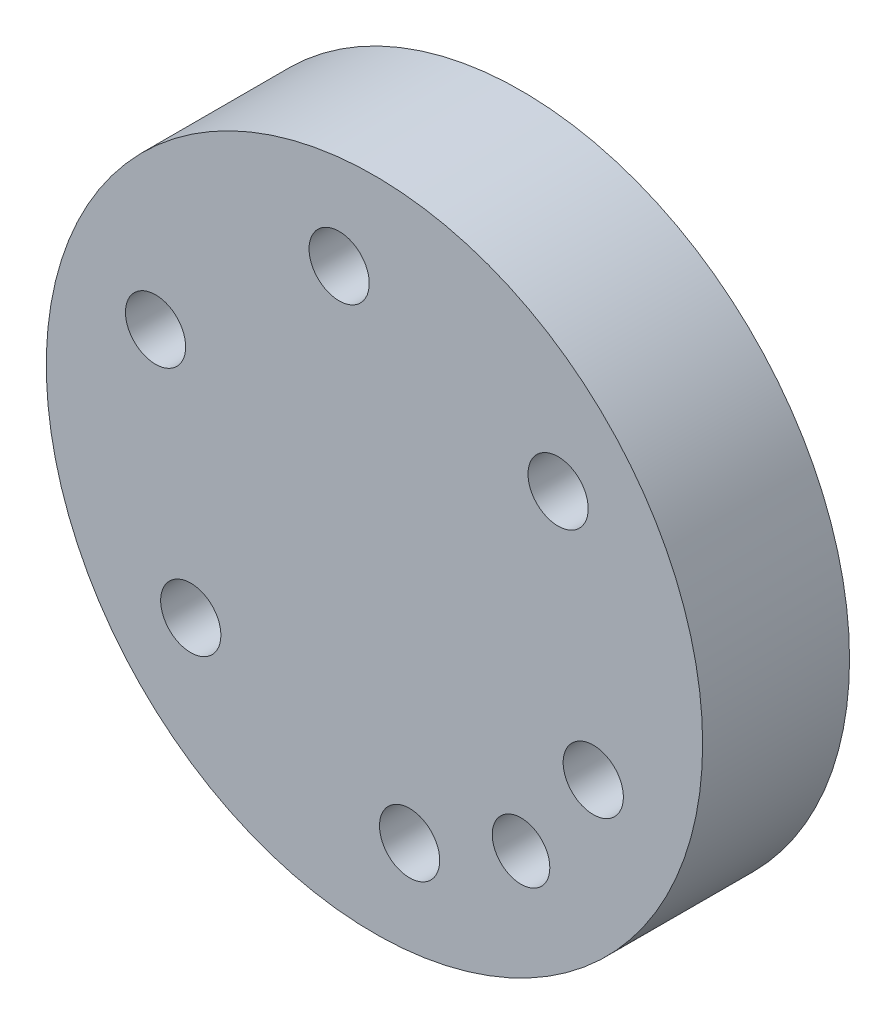
ISO-10303-21;
HEADER;
FILE_DESCRIPTION(('STEP AP214'),'2;1');
FILE_NAME('part.step','',(''),(''),'','','');
FILE_SCHEMA(('AUTOMOTIVE_DESIGN { 1 0 10303 214 1 1 1 1 }'));
ENDSEC;
DATA;
#1=APPLICATION_CONTEXT('core data for automotive mechanical design processes');
#2=APPLICATION_PROTOCOL_DEFINITION('international standard','automotive_design',2000,#1);
#3=PRODUCT_CONTEXT('',#1,'mechanical');
#4=PRODUCT('Part','Part','',(#3));
#5=PRODUCT_RELATED_PRODUCT_CATEGORY('part','',(#4));
#6=PRODUCT_DEFINITION_FORMATION('','',#4);
#7=PRODUCT_DEFINITION_CONTEXT('part definition',#1,'design');
#8=PRODUCT_DEFINITION('design','',#6,#7);
#9=PRODUCT_DEFINITION_SHAPE('','',#8);
#10=(LENGTH_UNIT() NAMED_UNIT(*) SI_UNIT(.MILLI.,.METRE.));
#11=(NAMED_UNIT(*) PLANE_ANGLE_UNIT() SI_UNIT($,.RADIAN.));
#12=(NAMED_UNIT(*) SI_UNIT($,.STERADIAN.) SOLID_ANGLE_UNIT());
#13=UNCERTAINTY_MEASURE_WITH_UNIT(LENGTH_MEASURE(1.E-05),#10,'distance_accuracy_value','');
#14=(GEOMETRIC_REPRESENTATION_CONTEXT(3) GLOBAL_UNCERTAINTY_ASSIGNED_CONTEXT((#13)) GLOBAL_UNIT_ASSIGNED_CONTEXT((#10,
#11,#12)) REPRESENTATION_CONTEXT('',''));
#15=CARTESIAN_POINT('',(0.,0.,0.));
#16=DIRECTION('',(0.,0.,1.));
#17=DIRECTION('',(1.,0.,0.));
#18=AXIS2_PLACEMENT_3D('',#15,#16,#17);
#19=CARTESIAN_POINT('',(22.3808308558776,278.150413141266,-291.081485964987));
#20=DIRECTION('',(0.,0.,1.));
#21=DIRECTION('',(1.,0.,0.));
#22=AXIS2_PLACEMENT_3D('',#19,#20,#21);
#23=CYLINDRICAL_SURFACE('',#22,88.7);
#24=CARTESIAN_POINT('',(22.3808308558776,278.150413141266,-24.7));
#25=DIRECTION('',(0.,0.,1.));
#26=DIRECTION('',(0.,-1.,0.));
#27=AXIS2_PLACEMENT_3D('',#24,#25,#26);
#28=CIRCLE('',#27,88.7);
#29=CARTESIAN_POINT('',(22.3808308558776,189.450413141266,-24.7));
#30=VERTEX_POINT('',#29);
#31=EDGE_CURVE('E65',#30,#30,#28,.F.);
#32=ORIENTED_EDGE('',*,*,#31,.F.);
#33=EDGE_LOOP('',(#32));
#34=FACE_BOUND('',#33,.T.);
#35=CARTESIAN_POINT('',(22.3808308558776,278.150413141266,15.));
#36=DIRECTION('',(0.,0.,1.));
#37=DIRECTION('',(1.,0.,0.));
#38=AXIS2_PLACEMENT_3D('',#35,#36,#37);
#39=CIRCLE('',#38,88.7);
#40=CARTESIAN_POINT('',(111.080830855878,278.150413141266,15.));
#41=VERTEX_POINT('',#40);
#42=EDGE_CURVE('E69',#41,#41,#39,.T.);
#43=ORIENTED_EDGE('',*,*,#42,.F.);
#44=EDGE_LOOP('',(#43));
#45=FACE_BOUND('',#44,.T.);
#46=ADVANCED_FACE('F39',(#34,#45),#23,.T.);
#47=CARTESIAN_POINT('',(22.3808308558776,278.150413141266,-291.081485964987));
#48=DIRECTION('',(0.,0.,1.));
#49=DIRECTION('',(1.,0.,0.));
#50=AXIS2_PLACEMENT_3D('',#47,#48,#49);
#51=CYLINDRICAL_SURFACE('',#50,76.4000000000001);
#52=CARTESIAN_POINT('',(22.3808308558776,278.150413141266,-15.9141467497714));
#53=DIRECTION('',(0.,0.,1.));
#54=DIRECTION('',(1.,0.,0.));
#55=AXIS2_PLACEMENT_3D('',#52,#53,#54);
#56=CIRCLE('',#55,76.4000000000001);
#57=CARTESIAN_POINT('',(98.7808308558778,278.150413141266,-15.9141467497714));
#58=VERTEX_POINT('',#57);
#59=EDGE_CURVE('E54',#58,#58,#56,.F.);
#60=ORIENTED_EDGE('',*,*,#59,.T.);
#61=EDGE_LOOP('',(#60));
#62=FACE_BOUND('',#61,.T.);
#63=CARTESIAN_POINT('',(22.3808308558776,278.150413141266,0.));
#64=DIRECTION('',(0.,0.,1.));
#65=DIRECTION('',(1.,0.,0.));
#66=AXIS2_PLACEMENT_3D('',#63,#64,#65);
#67=CIRCLE('',#66,76.4000000000001);
#68=CARTESIAN_POINT('',(98.7808308558778,278.150413141266,0.));
#69=VERTEX_POINT('',#68);
#70=EDGE_CURVE('E66',#69,#69,#67,.T.);
#71=ORIENTED_EDGE('',*,*,#70,.T.);
#72=EDGE_LOOP('',(#71));
#73=FACE_BOUND('',#72,.T.);
#74=ADVANCED_FACE('F135',(#62,#73),#51,.F.);
#75=CARTESIAN_POINT('',(22.3808308558776,278.150413141266,-24.7));
#76=DIRECTION('',(0.,0.,1.));
#77=DIRECTION('',(0.972273860255017,-0.233845121105419,0.));
#78=AXIS2_PLACEMENT_3D('',#75,#76,#77);
#79=PLANE('',#78);
#80=CARTESIAN_POINT('',(22.3808308558776,278.150413141266,-24.7));
#81=DIRECTION('',(0.,0.,1.));
#82=DIRECTION('',(0.,-1.,0.));
#83=AXIS2_PLACEMENT_3D('',#80,#81,#82);
#84=CIRCLE('',#83,82.0696949688358);
#85=CARTESIAN_POINT('',(22.3808308558776,196.08071817243,-24.7));
#86=VERTEX_POINT('',#85);
#87=EDGE_CURVE('E46',#86,#86,#84,.T.);
#88=ORIENTED_EDGE('',*,*,#87,.T.);
#89=EDGE_LOOP('',(#88));
#90=FACE_BOUND('',#89,.T.);
#91=ORIENTED_EDGE('',*,*,#31,.T.);
#92=EDGE_LOOP('',(#91));
#93=FACE_BOUND('',#92,.T.);
#94=ADVANCED_FACE('F130',(#90,#93),#79,.F.);
#95=CARTESIAN_POINT('',(22.3808308558776,278.150413141266,0.));
#96=DIRECTION('',(0.,0.,1.));
#97=DIRECTION('',(1.,0.,0.));
#98=AXIS2_PLACEMENT_3D('',#95,#96,#97);
#99=PLANE('',#98);
#100=CARTESIAN_POINT('',(61.9964694726047,228.53305193742,0.));
#101=DIRECTION('',(0.,0.,1.));
#102=DIRECTION('',(1.,0.,0.));
#103=AXIS2_PLACEMENT_3D('',#100,#101,#102);
#104=CIRCLE('',#103,9.77968966364631);
#105=CARTESIAN_POINT('',(71.776159136251,228.53305193742,0.));
#106=VERTEX_POINT('',#105);
#107=EDGE_CURVE('E62',#106,#106,#104,.T.);
#108=ORIENTED_EDGE('',*,*,#107,.T.);
#109=EDGE_LOOP('',(#108));
#110=FACE_BOUND('',#109,.T.);
#111=CARTESIAN_POINT('',(81.5193470873584,254.971228105767,0.));
#112=DIRECTION('',(0.,0.,1.));
#113=DIRECTION('',(1.,0.,0.));
#114=AXIS2_PLACEMENT_3D('',#111,#112,#113);
#115=CIRCLE('',#114,8.13749999999999);
#116=CARTESIAN_POINT('',(89.6568470873584,254.971228105767,0.));
#117=VERTEX_POINT('',#116);
#118=EDGE_CURVE('E105',#117,#117,#115,.T.);
#119=ORIENTED_EDGE('',*,*,#118,.T.);
#120=EDGE_LOOP('',(#119));
#121=FACE_BOUND('',#120,.T.);
#122=CARTESIAN_POINT('',(31.880563492685,215.334967411074,0.));
#123=DIRECTION('',(0.,0.,1.));
#124=DIRECTION('',(1.,0.,0.));
#125=AXIS2_PLACEMENT_3D('',#122,#123,#124);
#126=CIRCLE('',#125,8.1375);
#127=CARTESIAN_POINT('',(40.018063492685,215.334967411074,0.));
#128=VERTEX_POINT('',#127);
#129=EDGE_CURVE('E99',#128,#128,#126,.T.);
#130=ORIENTED_EDGE('',*,*,#129,.T.);
#131=EDGE_LOOP('',(#130));
#132=FACE_BOUND('',#131,.T.);
#133=CARTESIAN_POINT('',(-27.2647840173544,238.487003794824,0.));
#134=DIRECTION('',(0.,0.,1.));
#135=DIRECTION('',(1.,0.,0.));
#136=AXIS2_PLACEMENT_3D('',#133,#134,#135);
#137=CIRCLE('',#136,8.1375);
#138=CARTESIAN_POINT('',(-19.1272840173544,238.487003794824,0.));
#139=VERTEX_POINT('',#138);
#140=EDGE_CURVE('E93',#139,#139,#137,.T.);
#141=ORIENTED_EDGE('',*,*,#140,.T.);
#142=EDGE_LOOP('',(#141));
#143=FACE_BOUND('',#142,.T.);
#144=CARTESIAN_POINT('',(-36.7846201529286,301.218051089699,0.));
#145=DIRECTION('',(0.,0.,1.));
#146=DIRECTION('',(1.,0.,0.));
#147=AXIS2_PLACEMENT_3D('',#144,#145,#146);
#148=CIRCLE('',#147,8.1375);
#149=CARTESIAN_POINT('',(-28.6471201529286,301.218051089699,0.));
#150=VERTEX_POINT('',#149);
#151=EDGE_CURVE('E87',#150,#150,#148,.T.);
#152=ORIENTED_EDGE('',*,*,#151,.T.);
#153=EDGE_LOOP('',(#152));
#154=FACE_BOUND('',#153,.T.);
#155=CARTESIAN_POINT('',(72.0102436325622,317.734321350223,0.));
#156=DIRECTION('',(0.,0.,1.));
#157=DIRECTION('',(1.,0.,0.));
#158=AXIS2_PLACEMENT_3D('',#155,#156,#157);
#159=CIRCLE('',#158,8.13749999999999);
#160=CARTESIAN_POINT('',(80.1477436325622,317.734321350223,0.));
#161=VERTEX_POINT('',#160);
#162=EDGE_CURVE('E81',#161,#161,#159,.T.);
#163=ORIENTED_EDGE('',*,*,#162,.T.);
#164=EDGE_LOOP('',(#163));
#165=FACE_BOUND('',#164,.T.);
#166=CARTESIAN_POINT('',(12.834949907145,340.867975838614,0.));
#167=DIRECTION('',(0.,0.,1.));
#168=DIRECTION('',(1.,0.,0.));
#169=AXIS2_PLACEMENT_3D('',#166,#167,#168);
#170=CIRCLE('',#169,8.13750000000001);
#171=CARTESIAN_POINT('',(20.9724499071451,340.867975838614,0.));
#172=VERTEX_POINT('',#171);
#173=EDGE_CURVE('E75',#172,#172,#170,.T.);
#174=ORIENTED_EDGE('',*,*,#173,.T.);
#175=EDGE_LOOP('',(#174));
#176=FACE_BOUND('',#175,.T.);
#177=ORIENTED_EDGE('',*,*,#70,.F.);
#178=EDGE_LOOP('',(#177));
#179=FACE_BOUND('',#178,.T.);
#180=ADVANCED_FACE('F119',(#110,#121,#132,#143,#154,#165,#176,#179),#99,.F.);
#181=CARTESIAN_POINT('',(22.3808308558776,278.150413141266,15.));
#182=DIRECTION('',(0.,0.,1.));
#183=DIRECTION('',(1.,0.,0.));
#184=AXIS2_PLACEMENT_3D('',#181,#182,#183);
#185=PLANE('',#184);
#186=CARTESIAN_POINT('',(81.5193470873584,254.971228105767,15.));
#187=DIRECTION('',(0.,0.,1.));
#188=DIRECTION('',(1.,0.,0.));
#189=AXIS2_PLACEMENT_3D('',#186,#187,#188);
#190=CIRCLE('',#189,8.13749999999999);
#191=CARTESIAN_POINT('',(89.6568470873584,254.971228105767,15.));
#192=VERTEX_POINT('',#191);
#193=EDGE_CURVE('E102',#192,#192,#190,.T.);
#194=ORIENTED_EDGE('',*,*,#193,.F.);
#195=EDGE_LOOP('',(#194));
#196=FACE_BOUND('',#195,.T.);
#197=CARTESIAN_POINT('',(-27.2647840173544,238.487003794824,15.));
#198=DIRECTION('',(0.,0.,1.));
#199=DIRECTION('',(1.,0.,0.));
#200=AXIS2_PLACEMENT_3D('',#197,#198,#199);
#201=CIRCLE('',#200,8.1375);
#202=CARTESIAN_POINT('',(-19.1272840173544,238.487003794824,15.));
#203=VERTEX_POINT('',#202);
#204=EDGE_CURVE('E90',#203,#203,#201,.T.);
#205=ORIENTED_EDGE('',*,*,#204,.F.);
#206=EDGE_LOOP('',(#205));
#207=FACE_BOUND('',#206,.T.);
#208=CARTESIAN_POINT('',(72.0102436325622,317.734321350223,15.));
#209=DIRECTION('',(0.,0.,1.));
#210=DIRECTION('',(1.,0.,0.));
#211=AXIS2_PLACEMENT_3D('',#208,#209,#210);
#212=CIRCLE('',#211,8.13749999999999);
#213=CARTESIAN_POINT('',(80.1477436325622,317.734321350223,15.));
#214=VERTEX_POINT('',#213);
#215=EDGE_CURVE('E78',#214,#214,#212,.T.);
#216=ORIENTED_EDGE('',*,*,#215,.F.);
#217=EDGE_LOOP('',(#216));
#218=FACE_BOUND('',#217,.T.);
#219=ORIENTED_EDGE('',*,*,#42,.T.);
#220=EDGE_LOOP('',(#219));
#221=FACE_BOUND('',#220,.T.);
#222=CARTESIAN_POINT('',(12.834949907145,340.867975838614,15.));
#223=DIRECTION('',(0.,0.,1.));
#224=DIRECTION('',(1.,0.,0.));
#225=AXIS2_PLACEMENT_3D('',#222,#223,#224);
#226=CIRCLE('',#225,8.13750000000001);
#227=CARTESIAN_POINT('',(20.9724499071451,340.867975838614,15.));
#228=VERTEX_POINT('',#227);
#229=EDGE_CURVE('E74',#228,#228,#226,.T.);
#230=ORIENTED_EDGE('',*,*,#229,.F.);
#231=EDGE_LOOP('',(#230));
#232=FACE_BOUND('',#231,.T.);
#233=CARTESIAN_POINT('',(-36.7846201529286,301.218051089699,15.));
#234=DIRECTION('',(0.,0.,1.));
#235=DIRECTION('',(1.,0.,0.));
#236=AXIS2_PLACEMENT_3D('',#233,#234,#235);
#237=CIRCLE('',#236,8.1375);
#238=CARTESIAN_POINT('',(-28.6471201529286,301.218051089699,15.));
#239=VERTEX_POINT('',#238);
#240=EDGE_CURVE('E84',#239,#239,#237,.T.);
#241=ORIENTED_EDGE('',*,*,#240,.F.);
#242=EDGE_LOOP('',(#241));
#243=FACE_BOUND('',#242,.T.);
#244=CARTESIAN_POINT('',(31.880563492685,215.334967411074,15.));
#245=DIRECTION('',(0.,0.,1.));
#246=DIRECTION('',(1.,0.,0.));
#247=AXIS2_PLACEMENT_3D('',#244,#245,#246);
#248=CIRCLE('',#247,8.1375);
#249=CARTESIAN_POINT('',(40.018063492685,215.334967411074,15.));
#250=VERTEX_POINT('',#249);
#251=EDGE_CURVE('E96',#250,#250,#248,.T.);
#252=ORIENTED_EDGE('',*,*,#251,.F.);
#253=EDGE_LOOP('',(#252));
#254=FACE_BOUND('',#253,.T.);
#255=CARTESIAN_POINT('',(61.9964694726047,228.53305193742,15.));
#256=DIRECTION('',(0.,0.,1.));
#257=DIRECTION('',(1.,0.,0.));
#258=AXIS2_PLACEMENT_3D('',#255,#256,#257);
#259=CIRCLE('',#258,7.77968966364631);
#260=CARTESIAN_POINT('',(69.776159136251,228.53305193742,15.));
#261=VERTEX_POINT('',#260);
#262=EDGE_CURVE('E108',#261,#261,#259,.T.);
#263=ORIENTED_EDGE('',*,*,#262,.F.);
#264=EDGE_LOOP('',(#263));
#265=FACE_BOUND('',#264,.T.);
#266=ADVANCED_FACE('F116',(#196,#207,#218,#221,#232,#243,#254,#265),#185,.T.);
#267=CARTESIAN_POINT('',(12.834949907145,340.867975838614,15.));
#268=DIRECTION('',(0.,0.,-1.));
#269=DIRECTION('',(-1.,0.,0.));
#270=AXIS2_PLACEMENT_3D('',#267,#268,#269);
#271=CYLINDRICAL_SURFACE('',#270,8.13750000000001);
#272=ORIENTED_EDGE('',*,*,#229,.T.);
#273=EDGE_LOOP('',(#272));
#274=FACE_BOUND('',#273,.T.);
#275=ORIENTED_EDGE('',*,*,#173,.F.);
#276=EDGE_LOOP('',(#275));
#277=FACE_BOUND('',#276,.T.);
#278=ADVANCED_FACE('F118',(#274,#277),#271,.F.);
#279=CARTESIAN_POINT('',(72.0102436325622,317.734321350223,15.));
#280=DIRECTION('',(0.,0.,-1.));
#281=DIRECTION('',(-1.,0.,0.));
#282=AXIS2_PLACEMENT_3D('',#279,#280,#281);
#283=CYLINDRICAL_SURFACE('',#282,8.13749999999999);
#284=ORIENTED_EDGE('',*,*,#215,.T.);
#285=EDGE_LOOP('',(#284));
#286=FACE_BOUND('',#285,.T.);
#287=ORIENTED_EDGE('',*,*,#162,.F.);
#288=EDGE_LOOP('',(#287));
#289=FACE_BOUND('',#288,.T.);
#290=ADVANCED_FACE('F126',(#286,#289),#283,.F.);
#291=CARTESIAN_POINT('',(-36.7846201529286,301.218051089699,15.));
#292=DIRECTION('',(0.,0.,-1.));
#293=DIRECTION('',(-1.,0.,0.));
#294=AXIS2_PLACEMENT_3D('',#291,#292,#293);
#295=CYLINDRICAL_SURFACE('',#294,8.1375);
#296=ORIENTED_EDGE('',*,*,#240,.T.);
#297=EDGE_LOOP('',(#296));
#298=FACE_BOUND('',#297,.T.);
#299=ORIENTED_EDGE('',*,*,#151,.F.);
#300=EDGE_LOOP('',(#299));
#301=FACE_BOUND('',#300,.T.);
#302=ADVANCED_FACE('F224',(#298,#301),#295,.F.);
#303=CARTESIAN_POINT('',(-27.2647840173544,238.487003794824,15.));
#304=DIRECTION('',(0.,0.,-1.));
#305=DIRECTION('',(-1.,0.,0.));
#306=AXIS2_PLACEMENT_3D('',#303,#304,#305);
#307=CYLINDRICAL_SURFACE('',#306,8.1375);
#308=ORIENTED_EDGE('',*,*,#204,.T.);
#309=EDGE_LOOP('',(#308));
#310=FACE_BOUND('',#309,.T.);
#311=ORIENTED_EDGE('',*,*,#140,.F.);
#312=EDGE_LOOP('',(#311));
#313=FACE_BOUND('',#312,.T.);
#314=ADVANCED_FACE('F234',(#310,#313),#307,.F.);
#315=CARTESIAN_POINT('',(31.880563492685,215.334967411074,15.));
#316=DIRECTION('',(0.,0.,-1.));
#317=DIRECTION('',(-1.,0.,0.));
#318=AXIS2_PLACEMENT_3D('',#315,#316,#317);
#319=CYLINDRICAL_SURFACE('',#318,8.1375);
#320=ORIENTED_EDGE('',*,*,#251,.T.);
#321=EDGE_LOOP('',(#320));
#322=FACE_BOUND('',#321,.T.);
#323=ORIENTED_EDGE('',*,*,#129,.F.);
#324=EDGE_LOOP('',(#323));
#325=FACE_BOUND('',#324,.T.);
#326=ADVANCED_FACE('F244',(#322,#325),#319,.F.);
#327=CARTESIAN_POINT('',(81.5193470873584,254.971228105767,15.));
#328=DIRECTION('',(0.,0.,-1.));
#329=DIRECTION('',(-1.,0.,0.));
#330=AXIS2_PLACEMENT_3D('',#327,#328,#329);
#331=CYLINDRICAL_SURFACE('',#330,8.13749999999999);
#332=ORIENTED_EDGE('',*,*,#193,.T.);
#333=EDGE_LOOP('',(#332));
#334=FACE_BOUND('',#333,.T.);
#335=ORIENTED_EDGE('',*,*,#118,.F.);
#336=EDGE_LOOP('',(#335));
#337=FACE_BOUND('',#336,.T.);
#338=ADVANCED_FACE('F254',(#334,#337),#331,.F.);
#339=CARTESIAN_POINT('',(61.9964694726047,228.53305193742,15.));
#340=DIRECTION('',(0.,0.,-1.));
#341=DIRECTION('',(-1.,0.,0.));
#342=AXIS2_PLACEMENT_3D('',#339,#340,#341);
#343=CYLINDRICAL_SURFACE('',#342,7.77968966364631);
#344=CARTESIAN_POINT('',(61.9964694726047,228.53305193742,2.));
#345=DIRECTION('',(0.,0.,1.));
#346=DIRECTION('',(1.,0.,0.));
#347=AXIS2_PLACEMENT_3D('',#344,#345,#346);
#348=CIRCLE('',#347,7.77968966364631);
#349=CARTESIAN_POINT('',(69.776159136251,228.53305193742,2.));
#350=VERTEX_POINT('',#349);
#351=EDGE_CURVE('E59',#350,#350,#348,.F.);
#352=ORIENTED_EDGE('',*,*,#351,.T.);
#353=EDGE_LOOP('',(#352));
#354=FACE_BOUND('',#353,.T.);
#355=ORIENTED_EDGE('',*,*,#262,.T.);
#356=EDGE_LOOP('',(#355));
#357=FACE_BOUND('',#356,.T.);
#358=ADVANCED_FACE('F114',(#354,#357),#343,.F.);
#359=CARTESIAN_POINT('',(61.9964694726047,228.53305193742,2.));
#360=DIRECTION('',(0.,0.,1.));
#361=DIRECTION('',(1.,0.,0.));
#362=AXIS2_PLACEMENT_3D('',#359,#360,#361);
#363=TOROIDAL_SURFACE('',#362,9.77968966364631,2.);
#364=ORIENTED_EDGE('',*,*,#351,.F.);
#365=EDGE_LOOP('',(#364));
#366=FACE_BOUND('',#365,.T.);
#367=ORIENTED_EDGE('',*,*,#107,.F.);
#368=EDGE_LOOP('',(#367));
#369=FACE_BOUND('',#368,.T.);
#370=ADVANCED_FACE('F147',(#366,#369),#363,.T.);
#371=CARTESIAN_POINT('',(22.3808308558776,278.150413141266,-16.6999999999999));
#372=DIRECTION('',(0.,0.,-1.));
#373=DIRECTION('',(-1.,0.,0.));
#374=AXIS2_PLACEMENT_3D('',#371,#372,#373);
#375=CONICAL_SURFACE('',#374,76.4000000000001,0.512389460310735);
#376=CARTESIAN_POINT('',(22.3808308558776,278.150413141266,-23.6805224792651));
#377=DIRECTION('',(0.,0.,-1.));
#378=DIRECTION('',(-1.,0.,0.));
#379=AXIS2_PLACEMENT_3D('',#376,#377,#378);
#380=CIRCLE('',#379,80.3265438945868);
#381=CARTESIAN_POINT('',(-57.9457130387091,278.150413141266,-23.6805224792651));
#382=VERTEX_POINT('',#381);
#383=EDGE_CURVE('E10',#382,#382,#380,.T.);
#384=ORIENTED_EDGE('',*,*,#383,.T.);
#385=EDGE_LOOP('',(#384));
#386=FACE_BOUND('',#385,.T.);
#387=CARTESIAN_POINT('',(22.3808308558776,278.150413141266,-17.384930468669));
#388=DIRECTION('',(0.,0.,-1.));
#389=DIRECTION('',(-1.,0.,0.));
#390=AXIS2_PLACEMENT_3D('',#387,#388,#389);
#391=CIRCLE('',#390,76.7852733886265);
#392=CARTESIAN_POINT('',(-54.4044425327489,278.150413141266,-17.384930468669));
#393=VERTEX_POINT('',#392);
#394=EDGE_CURVE('E50',#393,#393,#391,.F.);
#395=ORIENTED_EDGE('',*,*,#394,.T.);
#396=EDGE_LOOP('',(#395));
#397=FACE_BOUND('',#396,.T.);
#398=ADVANCED_FACE('F150',(#386,#397),#375,.F.);
#399=CARTESIAN_POINT('',(22.3808308558776,278.150413141266,-15.9141467497714));
#400=DIRECTION('',(0.,0.,1.));
#401=DIRECTION('',(1.,0.,0.));
#402=AXIS2_PLACEMENT_3D('',#399,#400,#401);
#403=TOROIDAL_SURFACE('',#402,79.4000000000001,3.);
#404=ORIENTED_EDGE('',*,*,#394,.F.);
#405=EDGE_LOOP('',(#404));
#406=FACE_BOUND('',#405,.T.);
#407=ORIENTED_EDGE('',*,*,#59,.F.);
#408=EDGE_LOOP('',(#407));
#409=FACE_BOUND('',#408,.T.);
#410=ADVANCED_FACE('F156',(#406,#409),#403,.T.);
#411=CARTESIAN_POINT('',(22.3808308558776,278.150413141266,-22.7));
#412=DIRECTION('',(0.,0.,1.));
#413=DIRECTION('',(0.,-1.,0.));
#414=AXIS2_PLACEMENT_3D('',#411,#412,#413);
#415=TOROIDAL_SURFACE('',#414,82.0696949688358,2.);
#416=ORIENTED_EDGE('',*,*,#383,.F.);
#417=EDGE_LOOP('',(#416));
#418=FACE_BOUND('',#417,.T.);
#419=ORIENTED_EDGE('',*,*,#87,.F.);
#420=EDGE_LOOP('',(#419));
#421=FACE_BOUND('',#420,.T.);
#422=ADVANCED_FACE('F41',(#418,#421),#415,.T.);
#423=CLOSED_SHELL('',(#46,#74,#94,#180,#266,#278,#290,#302,#314,#326,#338,#358,#370,#398,#410,#422));
#424=MANIFOLD_SOLID_BREP('B2',#423);
#425=ADVANCED_BREP_SHAPE_REPRESENTATION('',(#18,#424),#14);
#426=SHAPE_DEFINITION_REPRESENTATION(#9,#425);
ENDSEC;
END-ISO-10303-21;
